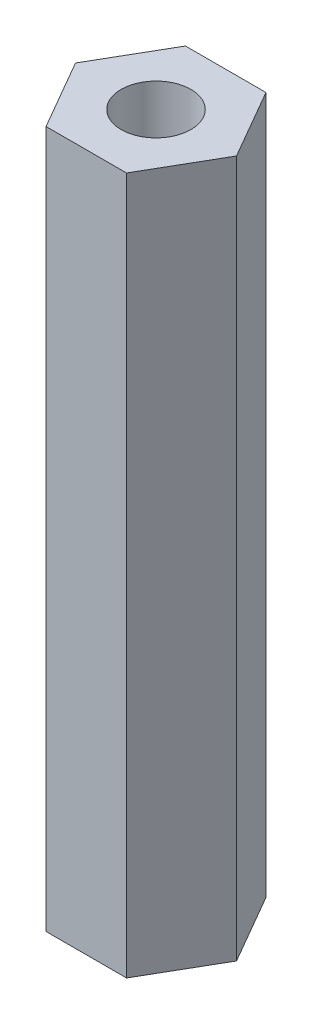
ISO-10303-21;
HEADER;
FILE_DESCRIPTION(('STEP AP214'),'2;1');
FILE_NAME('part.step','',(''),(''),'','','');
FILE_SCHEMA(('AUTOMOTIVE_DESIGN { 1 0 10303 214 1 1 1 1 }'));
ENDSEC;
DATA;
#1=APPLICATION_CONTEXT('core data for automotive mechanical design processes');
#2=APPLICATION_PROTOCOL_DEFINITION('international standard','automotive_design',2000,#1);
#3=PRODUCT_CONTEXT('',#1,'mechanical');
#4=PRODUCT('Part','Part','',(#3));
#5=PRODUCT_RELATED_PRODUCT_CATEGORY('part','',(#4));
#6=PRODUCT_DEFINITION_FORMATION('','',#4);
#7=PRODUCT_DEFINITION_CONTEXT('part definition',#1,'design');
#8=PRODUCT_DEFINITION('design','',#6,#7);
#9=PRODUCT_DEFINITION_SHAPE('','',#8);
#10=(LENGTH_UNIT() NAMED_UNIT(*) SI_UNIT(.MILLI.,.METRE.));
#11=(NAMED_UNIT(*) PLANE_ANGLE_UNIT() SI_UNIT($,.RADIAN.));
#12=(NAMED_UNIT(*) SI_UNIT($,.STERADIAN.) SOLID_ANGLE_UNIT());
#13=UNCERTAINTY_MEASURE_WITH_UNIT(LENGTH_MEASURE(1.E-05),#10,'distance_accuracy_value','');
#14=(GEOMETRIC_REPRESENTATION_CONTEXT(3) GLOBAL_UNCERTAINTY_ASSIGNED_CONTEXT((#13)) GLOBAL_UNIT_ASSIGNED_CONTEXT((#10,
#11,#12)) REPRESENTATION_CONTEXT('',''));
#15=CARTESIAN_POINT('',(0.,0.,0.));
#16=DIRECTION('',(0.,0.,1.));
#17=DIRECTION('',(1.,0.,0.));
#18=AXIS2_PLACEMENT_3D('',#15,#16,#17);
#19=CARTESIAN_POINT('',(0.,30.,0.));
#20=DIRECTION('',(0.,1.,0.));
#21=DIRECTION('',(0.,0.,1.));
#22=AXIS2_PLACEMENT_3D('',#19,#20,#21);
#23=PLANE('',#22);
#24=DIRECTION('',(-0.5,0.,-0.866025403784438));
#25=VECTOR('',#24,1.);
#26=CARTESIAN_POINT('',(3.46410161513776,30.,0.));
#27=LINE('',#26,#25);
#28=CARTESIAN_POINT('',(3.46410161513776,30.,0.));
#29=VERTEX_POINT('',#28);
#30=CARTESIAN_POINT('',(1.73205080756888,30.,-3.));
#31=VERTEX_POINT('',#30);
#32=EDGE_CURVE('E129',#29,#31,#27,.T.);
#33=ORIENTED_EDGE('',*,*,#32,.T.);
#34=DIRECTION('',(-1.,0.,0.));
#35=VECTOR('',#34,1.);
#36=CARTESIAN_POINT('',(1.73205080756888,30.,-3.));
#37=LINE('',#36,#35);
#38=CARTESIAN_POINT('',(-1.73205080756888,30.,-3.));
#39=VERTEX_POINT('',#38);
#40=EDGE_CURVE('E87',#31,#39,#37,.T.);
#41=ORIENTED_EDGE('',*,*,#40,.T.);
#42=DIRECTION('',(-0.5,0.,0.866025403784439));
#43=VECTOR('',#42,1.);
#44=CARTESIAN_POINT('',(-1.73205080756888,30.,-3.));
#45=LINE('',#44,#43);
#46=CARTESIAN_POINT('',(-3.46410161513775,30.,0.));
#47=VERTEX_POINT('',#46);
#48=EDGE_CURVE('E100',#39,#47,#45,.T.);
#49=ORIENTED_EDGE('',*,*,#48,.T.);
#50=DIRECTION('',(0.5,0.,0.866025403784438));
#51=VECTOR('',#50,1.);
#52=CARTESIAN_POINT('',(-3.46410161513775,30.,0.));
#53=LINE('',#52,#51);
#54=CARTESIAN_POINT('',(-1.73205080756888,30.,3.));
#55=VERTEX_POINT('',#54);
#56=EDGE_CURVE('E94',#47,#55,#53,.T.);
#57=ORIENTED_EDGE('',*,*,#56,.T.);
#58=DIRECTION('',(1.,0.,0.));
#59=VECTOR('',#58,1.);
#60=CARTESIAN_POINT('',(-1.73205080756888,30.,3.));
#61=LINE('',#60,#59);
#62=CARTESIAN_POINT('',(1.73205080756888,30.,3.));
#63=VERTEX_POINT('',#62);
#64=EDGE_CURVE('E98',#55,#63,#61,.T.);
#65=ORIENTED_EDGE('',*,*,#64,.T.);
#66=DIRECTION('',(0.5,0.,-0.866025403784438));
#67=VECTOR('',#66,1.);
#68=CARTESIAN_POINT('',(1.73205080756888,30.,3.));
#69=LINE('',#68,#67);
#70=EDGE_CURVE('E50',#63,#29,#69,.T.);
#71=ORIENTED_EDGE('',*,*,#70,.T.);
#72=EDGE_LOOP('',(#33,#41,#49,#57,#65,#71));
#73=FACE_BOUND('',#72,.T.);
#74=CARTESIAN_POINT('',(0.,30.,0.));
#75=DIRECTION('',(0.,1.,0.));
#76=DIRECTION('',(0.,0.,1.));
#77=AXIS2_PLACEMENT_3D('',#74,#75,#76);
#78=CIRCLE('',#77,1.5);
#79=CARTESIAN_POINT('',(0.,30.,1.5));
#80=VERTEX_POINT('',#79);
#81=EDGE_CURVE('E122',#80,#80,#78,.T.);
#82=ORIENTED_EDGE('',*,*,#81,.F.);
#83=EDGE_LOOP('',(#82));
#84=FACE_BOUND('',#83,.T.);
#85=ADVANCED_FACE('F33',(#73,#84),#23,.T.);
#86=CARTESIAN_POINT('',(0.,0.,0.));
#87=DIRECTION('',(0.,1.,0.));
#88=DIRECTION('',(0.,0.,1.));
#89=AXIS2_PLACEMENT_3D('',#86,#87,#88);
#90=PLANE('',#89);
#91=DIRECTION('',(-0.5,0.,-0.866025403784438));
#92=VECTOR('',#91,1.);
#93=CARTESIAN_POINT('',(3.46410161513776,0.,0.));
#94=LINE('',#93,#92);
#95=CARTESIAN_POINT('',(3.46410161513776,0.,0.));
#96=VERTEX_POINT('',#95);
#97=CARTESIAN_POINT('',(1.73205080756888,0.,-3.));
#98=VERTEX_POINT('',#97);
#99=EDGE_CURVE('E118',#96,#98,#94,.T.);
#100=ORIENTED_EDGE('',*,*,#99,.F.);
#101=DIRECTION('',(0.5,0.,-0.866025403784438));
#102=VECTOR('',#101,1.);
#103=CARTESIAN_POINT('',(1.73205080756888,0.,3.));
#104=LINE('',#103,#102);
#105=CARTESIAN_POINT('',(1.73205080756888,0.,3.));
#106=VERTEX_POINT('',#105);
#107=EDGE_CURVE('E79',#106,#96,#104,.T.);
#108=ORIENTED_EDGE('',*,*,#107,.F.);
#109=DIRECTION('',(1.,0.,0.));
#110=VECTOR('',#109,1.);
#111=CARTESIAN_POINT('',(-1.73205080756888,0.,3.));
#112=LINE('',#111,#110);
#113=CARTESIAN_POINT('',(-1.73205080756888,0.,3.));
#114=VERTEX_POINT('',#113);
#115=EDGE_CURVE('E73',#114,#106,#112,.T.);
#116=ORIENTED_EDGE('',*,*,#115,.F.);
#117=DIRECTION('',(0.5,0.,0.866025403784438));
#118=VECTOR('',#117,1.);
#119=CARTESIAN_POINT('',(-3.46410161513775,0.,0.));
#120=LINE('',#119,#118);
#121=CARTESIAN_POINT('',(-3.46410161513775,0.,0.));
#122=VERTEX_POINT('',#121);
#123=EDGE_CURVE('E108',#122,#114,#120,.T.);
#124=ORIENTED_EDGE('',*,*,#123,.F.);
#125=DIRECTION('',(-0.5,0.,0.866025403784439));
#126=VECTOR('',#125,1.);
#127=CARTESIAN_POINT('',(-1.73205080756888,0.,-3.));
#128=LINE('',#127,#126);
#129=CARTESIAN_POINT('',(-1.73205080756888,0.,-3.));
#130=VERTEX_POINT('',#129);
#131=EDGE_CURVE('E124',#130,#122,#128,.T.);
#132=ORIENTED_EDGE('',*,*,#131,.F.);
#133=DIRECTION('',(-1.,0.,0.));
#134=VECTOR('',#133,1.);
#135=CARTESIAN_POINT('',(1.73205080756888,0.,-3.));
#136=LINE('',#135,#134);
#137=EDGE_CURVE('E121',#98,#130,#136,.T.);
#138=ORIENTED_EDGE('',*,*,#137,.F.);
#139=EDGE_LOOP('',(#100,#108,#116,#124,#132,#138));
#140=FACE_BOUND('',#139,.T.);
#141=CARTESIAN_POINT('',(0.,0.,0.));
#142=DIRECTION('',(0.,1.,0.));
#143=DIRECTION('',(0.,0.,1.));
#144=AXIS2_PLACEMENT_3D('',#141,#142,#143);
#145=CIRCLE('',#144,1.5);
#146=CARTESIAN_POINT('',(0.,0.,1.5));
#147=VERTEX_POINT('',#146);
#148=EDGE_CURVE('E222',#147,#147,#145,.T.);
#149=ORIENTED_EDGE('',*,*,#148,.T.);
#150=EDGE_LOOP('',(#149));
#151=FACE_BOUND('',#150,.T.);
#152=ADVANCED_FACE('F138',(#140,#151),#90,.F.);
#153=CARTESIAN_POINT('',(3.46410161513776,30.,0.));
#154=DIRECTION('',(-0.866025403784438,0.,0.5));
#155=DIRECTION('',(0.5,0.,0.866025403784439));
#156=AXIS2_PLACEMENT_3D('',#153,#154,#155);
#157=PLANE('',#156);
#158=ORIENTED_EDGE('',*,*,#99,.T.);
#159=DIRECTION('',(0.,-1.,0.));
#160=VECTOR('',#159,1.);
#161=CARTESIAN_POINT('',(1.73205080756888,30.,-3.));
#162=LINE('',#161,#160);
#163=EDGE_CURVE('E11',#31,#98,#162,.T.);
#164=ORIENTED_EDGE('',*,*,#163,.F.);
#165=ORIENTED_EDGE('',*,*,#32,.F.);
#166=DIRECTION('',(0.,-1.,0.));
#167=VECTOR('',#166,1.);
#168=CARTESIAN_POINT('',(3.46410161513776,30.,0.));
#169=LINE('',#168,#167);
#170=EDGE_CURVE('E114',#29,#96,#169,.T.);
#171=ORIENTED_EDGE('',*,*,#170,.T.);
#172=EDGE_LOOP('',(#158,#164,#165,#171));
#173=FACE_BOUND('',#172,.T.);
#174=ADVANCED_FACE('F35',(#173),#157,.F.);
#175=CARTESIAN_POINT('',(1.73205080756888,30.,-3.));
#176=DIRECTION('',(0.,0.,1.));
#177=DIRECTION('',(1.,0.,0.));
#178=AXIS2_PLACEMENT_3D('',#175,#176,#177);
#179=PLANE('',#178);
#180=ORIENTED_EDGE('',*,*,#137,.T.);
#181=DIRECTION('',(0.,-1.,0.));
#182=VECTOR('',#181,1.);
#183=CARTESIAN_POINT('',(-1.73205080756888,30.,-3.));
#184=LINE('',#183,#182);
#185=EDGE_CURVE('E42',#39,#130,#184,.T.);
#186=ORIENTED_EDGE('',*,*,#185,.F.);
#187=ORIENTED_EDGE('',*,*,#40,.F.);
#188=ORIENTED_EDGE('',*,*,#163,.T.);
#189=EDGE_LOOP('',(#180,#186,#187,#188));
#190=FACE_BOUND('',#189,.T.);
#191=ADVANCED_FACE('F163',(#190),#179,.F.);
#192=CARTESIAN_POINT('',(-1.73205080756888,30.,-3.));
#193=DIRECTION('',(0.866025403784439,0.,0.5));
#194=DIRECTION('',(0.5,0.,-0.866025403784439));
#195=AXIS2_PLACEMENT_3D('',#192,#193,#194);
#196=PLANE('',#195);
#197=ORIENTED_EDGE('',*,*,#131,.T.);
#198=DIRECTION('',(0.,-1.,0.));
#199=VECTOR('',#198,1.);
#200=CARTESIAN_POINT('',(-3.46410161513775,30.,0.));
#201=LINE('',#200,#199);
#202=EDGE_CURVE('E109',#47,#122,#201,.T.);
#203=ORIENTED_EDGE('',*,*,#202,.F.);
#204=ORIENTED_EDGE('',*,*,#48,.F.);
#205=ORIENTED_EDGE('',*,*,#185,.T.);
#206=EDGE_LOOP('',(#197,#203,#204,#205));
#207=FACE_BOUND('',#206,.T.);
#208=ADVANCED_FACE('F135',(#207),#196,.F.);
#209=CARTESIAN_POINT('',(-3.46410161513775,30.,0.));
#210=DIRECTION('',(0.866025403784438,0.,-0.5));
#211=DIRECTION('',(-0.5,0.,-0.866025403784439));
#212=AXIS2_PLACEMENT_3D('',#209,#210,#211);
#213=PLANE('',#212);
#214=ORIENTED_EDGE('',*,*,#123,.T.);
#215=DIRECTION('',(0.,-1.,0.));
#216=VECTOR('',#215,1.);
#217=CARTESIAN_POINT('',(-1.73205080756888,30.,3.));
#218=LINE('',#217,#216);
#219=EDGE_CURVE('E105',#55,#114,#218,.T.);
#220=ORIENTED_EDGE('',*,*,#219,.F.);
#221=ORIENTED_EDGE('',*,*,#56,.F.);
#222=ORIENTED_EDGE('',*,*,#202,.T.);
#223=EDGE_LOOP('',(#214,#220,#221,#222));
#224=FACE_BOUND('',#223,.T.);
#225=ADVANCED_FACE('F106',(#224),#213,.F.);
#226=CARTESIAN_POINT('',(-1.73205080756888,30.,3.));
#227=DIRECTION('',(0.,0.,-1.));
#228=DIRECTION('',(-1.,0.,0.));
#229=AXIS2_PLACEMENT_3D('',#226,#227,#228);
#230=PLANE('',#229);
#231=ORIENTED_EDGE('',*,*,#115,.T.);
#232=DIRECTION('',(0.,-1.,0.));
#233=VECTOR('',#232,1.);
#234=CARTESIAN_POINT('',(1.73205080756888,30.,3.));
#235=LINE('',#234,#233);
#236=EDGE_CURVE('E110',#63,#106,#235,.T.);
#237=ORIENTED_EDGE('',*,*,#236,.F.);
#238=ORIENTED_EDGE('',*,*,#64,.F.);
#239=ORIENTED_EDGE('',*,*,#219,.T.);
#240=EDGE_LOOP('',(#231,#237,#238,#239));
#241=FACE_BOUND('',#240,.T.);
#242=ADVANCED_FACE('F112',(#241),#230,.F.);
#243=CARTESIAN_POINT('',(1.73205080756888,30.,3.));
#244=DIRECTION('',(-0.866025403784438,0.,-0.5));
#245=DIRECTION('',(-0.5,0.,0.866025403784439));
#246=AXIS2_PLACEMENT_3D('',#243,#244,#245);
#247=PLANE('',#246);
#248=ORIENTED_EDGE('',*,*,#107,.T.);
#249=ORIENTED_EDGE('',*,*,#170,.F.);
#250=ORIENTED_EDGE('',*,*,#70,.F.);
#251=ORIENTED_EDGE('',*,*,#236,.T.);
#252=EDGE_LOOP('',(#248,#249,#250,#251));
#253=FACE_BOUND('',#252,.T.);
#254=ADVANCED_FACE('F143',(#253),#247,.F.);
#255=CARTESIAN_POINT('',(0.,30.,0.));
#256=DIRECTION('',(0.,-1.,0.));
#257=DIRECTION('',(0.,0.,-1.));
#258=AXIS2_PLACEMENT_3D('',#255,#256,#257);
#259=CYLINDRICAL_SURFACE('',#258,1.5);
#260=ORIENTED_EDGE('',*,*,#81,.T.);
#261=EDGE_LOOP('',(#260));
#262=FACE_BOUND('',#261,.T.);
#263=ORIENTED_EDGE('',*,*,#148,.F.);
#264=EDGE_LOOP('',(#263));
#265=FACE_BOUND('',#264,.T.);
#266=ADVANCED_FACE('F145',(#262,#265),#259,.F.);
#267=CLOSED_SHELL('',(#85,#152,#174,#191,#208,#225,#242,#254,#266));
#268=MANIFOLD_SOLID_BREP('B2',#267);
#269=ADVANCED_BREP_SHAPE_REPRESENTATION('',(#18,#268),#14);
#270=SHAPE_DEFINITION_REPRESENTATION(#9,#269);
ENDSEC;
END-ISO-10303-21;
